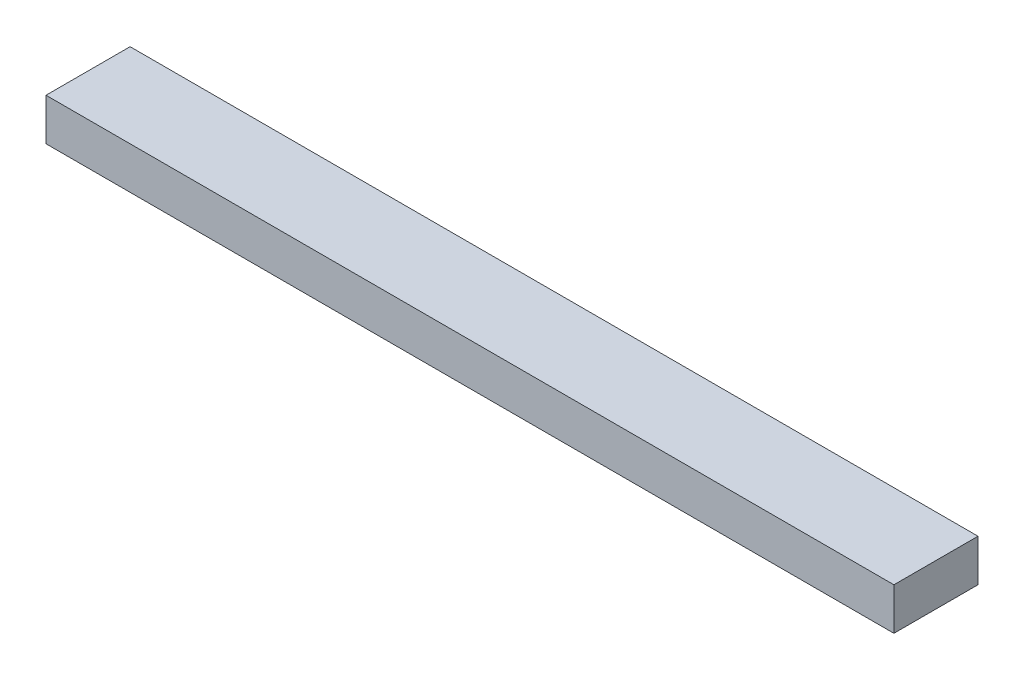
ISO-10303-21;
HEADER;
FILE_DESCRIPTION(('STEP AP214'),'2;1');
FILE_NAME('part.step','',(''),(''),'','','');
FILE_SCHEMA(('AUTOMOTIVE_DESIGN { 1 0 10303 214 1 1 1 1 }'));
ENDSEC;
DATA;
#1=APPLICATION_CONTEXT('core data for automotive mechanical design processes');
#2=APPLICATION_PROTOCOL_DEFINITION('international standard','automotive_design',2000,#1);
#3=PRODUCT_CONTEXT('',#1,'mechanical');
#4=PRODUCT('Part','Part','',(#3));
#5=PRODUCT_RELATED_PRODUCT_CATEGORY('part','',(#4));
#6=PRODUCT_DEFINITION_FORMATION('','',#4);
#7=PRODUCT_DEFINITION_CONTEXT('part definition',#1,'design');
#8=PRODUCT_DEFINITION('design','',#6,#7);
#9=PRODUCT_DEFINITION_SHAPE('','',#8);
#10=(LENGTH_UNIT() NAMED_UNIT(*) SI_UNIT(.MILLI.,.METRE.));
#11=(NAMED_UNIT(*) PLANE_ANGLE_UNIT() SI_UNIT($,.RADIAN.));
#12=(NAMED_UNIT(*) SI_UNIT($,.STERADIAN.) SOLID_ANGLE_UNIT());
#13=UNCERTAINTY_MEASURE_WITH_UNIT(LENGTH_MEASURE(1.E-05),#10,'distance_accuracy_value','');
#14=(GEOMETRIC_REPRESENTATION_CONTEXT(3) GLOBAL_UNCERTAINTY_ASSIGNED_CONTEXT((#13)) GLOBAL_UNIT_ASSIGNED_CONTEXT((#10,
#11,#12)) REPRESENTATION_CONTEXT('',''));
#15=CARTESIAN_POINT('',(0.,0.,0.));
#16=DIRECTION('',(0.,0.,1.));
#17=DIRECTION('',(1.,0.,0.));
#18=AXIS2_PLACEMENT_3D('',#15,#16,#17);
#19=CARTESIAN_POINT('',(-60.5,6.,-5.99999999999999));
#20=DIRECTION('',(1.,0.,0.));
#21=DIRECTION('',(0.,0.,-1.));
#22=AXIS2_PLACEMENT_3D('',#19,#20,#21);
#23=PLANE('',#22);
#24=DIRECTION('',(0.,0.,1.));
#25=VECTOR('',#24,1.);
#26=CARTESIAN_POINT('',(-60.5,0.,-5.99999999999999));
#27=LINE('',#26,#25);
#28=CARTESIAN_POINT('',(-60.5,0.,-5.99999999999999));
#29=VERTEX_POINT('',#28);
#30=CARTESIAN_POINT('',(-60.5,0.,6.00000000000001));
#31=VERTEX_POINT('',#30);
#32=EDGE_CURVE('E96',#29,#31,#27,.T.);
#33=ORIENTED_EDGE('',*,*,#32,.T.);
#34=DIRECTION('',(0.,-1.,0.));
#35=VECTOR('',#34,1.);
#36=CARTESIAN_POINT('',(-60.5,6.,6.00000000000001));
#37=LINE('',#36,#35);
#38=CARTESIAN_POINT('',(-60.5,6.,6.00000000000001));
#39=VERTEX_POINT('',#38);
#40=EDGE_CURVE('E11',#39,#31,#37,.T.);
#41=ORIENTED_EDGE('',*,*,#40,.F.);
#42=DIRECTION('',(0.,0.,1.));
#43=VECTOR('',#42,1.);
#44=CARTESIAN_POINT('',(-60.5,6.,-5.99999999999999));
#45=LINE('',#44,#43);
#46=CARTESIAN_POINT('',(-60.5,6.,-5.99999999999999));
#47=VERTEX_POINT('',#46);
#48=EDGE_CURVE('E84',#47,#39,#45,.T.);
#49=ORIENTED_EDGE('',*,*,#48,.F.);
#50=DIRECTION('',(0.,-1.,0.));
#51=VECTOR('',#50,1.);
#52=CARTESIAN_POINT('',(-60.5,6.,-5.99999999999999));
#53=LINE('',#52,#51);
#54=EDGE_CURVE('E92',#47,#29,#53,.T.);
#55=ORIENTED_EDGE('',*,*,#54,.T.);
#56=EDGE_LOOP('',(#33,#41,#49,#55));
#57=FACE_BOUND('',#56,.T.);
#58=ADVANCED_FACE('F33',(#57),#23,.F.);
#59=CARTESIAN_POINT('',(60.5,6.,5.99999999999999));
#60=DIRECTION('',(0.,0.,-1.));
#61=DIRECTION('',(-1.,0.,0.));
#62=AXIS2_PLACEMENT_3D('',#59,#60,#61);
#63=PLANE('',#62);
#64=DIRECTION('',(1.,0.,0.));
#65=VECTOR('',#64,1.);
#66=CARTESIAN_POINT('',(60.5,0.,5.99999999999999));
#67=LINE('',#66,#65);
#68=CARTESIAN_POINT('',(60.5,0.,5.99999999999999));
#69=VERTEX_POINT('',#68);
#70=EDGE_CURVE('E88',#31,#69,#67,.T.);
#71=ORIENTED_EDGE('',*,*,#70,.T.);
#72=DIRECTION('',(0.,-1.,0.));
#73=VECTOR('',#72,1.);
#74=CARTESIAN_POINT('',(60.5,6.,5.99999999999999));
#75=LINE('',#74,#73);
#76=CARTESIAN_POINT('',(60.5,6.,5.99999999999999));
#77=VERTEX_POINT('',#76);
#78=EDGE_CURVE('E41',#77,#69,#75,.T.);
#79=ORIENTED_EDGE('',*,*,#78,.F.);
#80=DIRECTION('',(1.,0.,0.));
#81=VECTOR('',#80,1.);
#82=CARTESIAN_POINT('',(60.5,6.,5.99999999999999));
#83=LINE('',#82,#81);
#84=EDGE_CURVE('E79',#39,#77,#83,.T.);
#85=ORIENTED_EDGE('',*,*,#84,.F.);
#86=ORIENTED_EDGE('',*,*,#40,.T.);
#87=EDGE_LOOP('',(#71,#79,#85,#86));
#88=FACE_BOUND('',#87,.T.);
#89=ADVANCED_FACE('F87',(#88),#63,.F.);
#90=CARTESIAN_POINT('',(60.5,6.,-6.00000000000001));
#91=DIRECTION('',(-1.,0.,0.));
#92=DIRECTION('',(0.,0.,1.));
#93=AXIS2_PLACEMENT_3D('',#90,#91,#92);
#94=PLANE('',#93);
#95=DIRECTION('',(0.,0.,-1.));
#96=VECTOR('',#95,1.);
#97=CARTESIAN_POINT('',(60.5,0.,-6.00000000000001));
#98=LINE('',#97,#96);
#99=CARTESIAN_POINT('',(60.5,0.,-6.00000000000001));
#100=VERTEX_POINT('',#99);
#101=EDGE_CURVE('E66',#69,#100,#98,.T.);
#102=ORIENTED_EDGE('',*,*,#101,.T.);
#103=DIRECTION('',(0.,-1.,0.));
#104=VECTOR('',#103,1.);
#105=CARTESIAN_POINT('',(60.5,6.,-6.00000000000001));
#106=LINE('',#105,#104);
#107=CARTESIAN_POINT('',(60.5,6.,-6.00000000000001));
#108=VERTEX_POINT('',#107);
#109=EDGE_CURVE('E89',#108,#100,#106,.T.);
#110=ORIENTED_EDGE('',*,*,#109,.F.);
#111=DIRECTION('',(0.,0.,-1.));
#112=VECTOR('',#111,1.);
#113=CARTESIAN_POINT('',(60.5,6.,-6.00000000000001));
#114=LINE('',#113,#112);
#115=EDGE_CURVE('E82',#77,#108,#114,.T.);
#116=ORIENTED_EDGE('',*,*,#115,.F.);
#117=ORIENTED_EDGE('',*,*,#78,.T.);
#118=EDGE_LOOP('',(#102,#110,#116,#117));
#119=FACE_BOUND('',#118,.T.);
#120=ADVANCED_FACE('F90',(#119),#94,.F.);
#121=CARTESIAN_POINT('',(60.5,6.,-6.00000000000001));
#122=DIRECTION('',(0.,0.,1.));
#123=DIRECTION('',(1.,0.,0.));
#124=AXIS2_PLACEMENT_3D('',#121,#122,#123);
#125=PLANE('',#124);
#126=DIRECTION('',(-1.,0.,0.));
#127=VECTOR('',#126,1.);
#128=CARTESIAN_POINT('',(60.5,0.,-6.00000000000001));
#129=LINE('',#128,#127);
#130=EDGE_CURVE('E72',#100,#29,#129,.T.);
#131=ORIENTED_EDGE('',*,*,#130,.T.);
#132=ORIENTED_EDGE('',*,*,#54,.F.);
#133=DIRECTION('',(-1.,0.,0.));
#134=VECTOR('',#133,1.);
#135=CARTESIAN_POINT('',(60.5,6.,-6.00000000000001));
#136=LINE('',#135,#134);
#137=EDGE_CURVE('E49',#108,#47,#136,.T.);
#138=ORIENTED_EDGE('',*,*,#137,.F.);
#139=ORIENTED_EDGE('',*,*,#109,.T.);
#140=EDGE_LOOP('',(#131,#132,#138,#139));
#141=FACE_BOUND('',#140,.T.);
#142=ADVANCED_FACE('F103',(#141),#125,.F.);
#143=CARTESIAN_POINT('',(0.,6.,0.));
#144=DIRECTION('',(0.,-1.,0.));
#145=DIRECTION('',(0.,0.,-1.));
#146=AXIS2_PLACEMENT_3D('',#143,#144,#145);
#147=PLANE('',#146);
#148=ORIENTED_EDGE('',*,*,#48,.T.);
#149=ORIENTED_EDGE('',*,*,#84,.T.);
#150=ORIENTED_EDGE('',*,*,#115,.T.);
#151=ORIENTED_EDGE('',*,*,#137,.T.);
#152=EDGE_LOOP('',(#148,#149,#150,#151));
#153=FACE_BOUND('',#152,.T.);
#154=ADVANCED_FACE('F80',(#153),#147,.F.);
#155=CARTESIAN_POINT('',(0.,0.,0.));
#156=DIRECTION('',(0.,-1.,0.));
#157=DIRECTION('',(0.,0.,-1.));
#158=AXIS2_PLACEMENT_3D('',#155,#156,#157);
#159=PLANE('',#158);
#160=ORIENTED_EDGE('',*,*,#32,.F.);
#161=ORIENTED_EDGE('',*,*,#130,.F.);
#162=ORIENTED_EDGE('',*,*,#101,.F.);
#163=ORIENTED_EDGE('',*,*,#70,.F.);
#164=EDGE_LOOP('',(#160,#161,#162,#163));
#165=FACE_BOUND('',#164,.T.);
#166=ADVANCED_FACE('F106',(#165),#159,.T.);
#167=CLOSED_SHELL('',(#58,#89,#120,#142,#154,#166));
#168=MANIFOLD_SOLID_BREP('B2',#167);
#169=ADVANCED_BREP_SHAPE_REPRESENTATION('',(#18,#168),#14);
#170=SHAPE_DEFINITION_REPRESENTATION(#9,#169);
ENDSEC;
END-ISO-10303-21;
